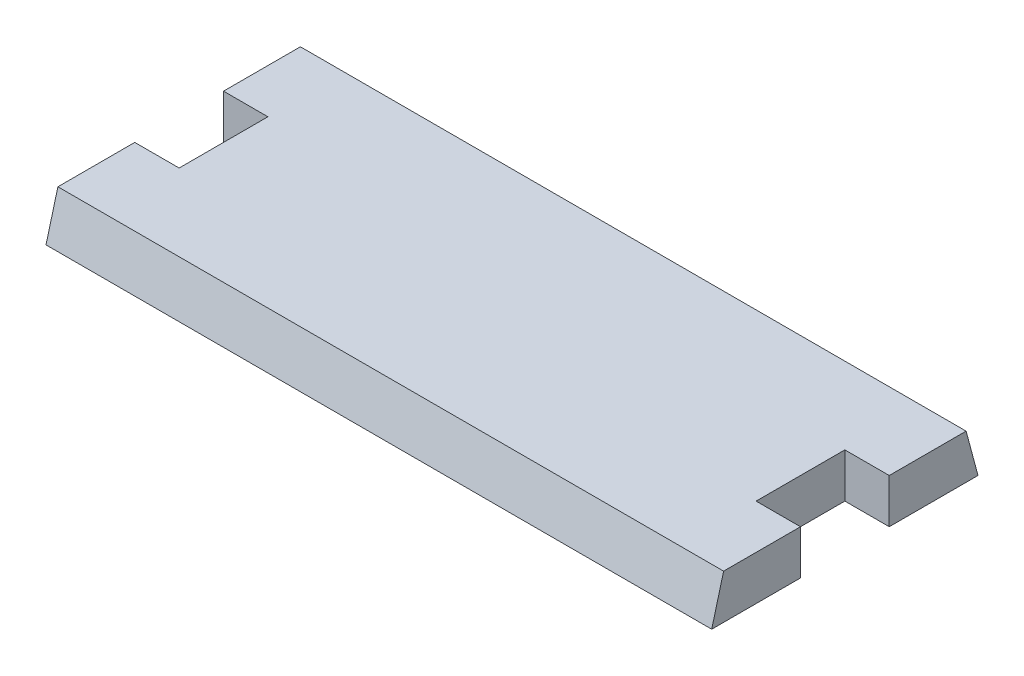
ISO-10303-21;
HEADER;
FILE_DESCRIPTION(('STEP AP214'),'2;1');
FILE_NAME('part.step','',(''),(''),'','','');
FILE_SCHEMA(('AUTOMOTIVE_DESIGN { 1 0 10303 214 1 1 1 1 }'));
ENDSEC;
DATA;
#1=APPLICATION_CONTEXT('core data for automotive mechanical design processes');
#2=APPLICATION_PROTOCOL_DEFINITION('international standard','automotive_design',2000,#1);
#3=PRODUCT_CONTEXT('',#1,'mechanical');
#4=PRODUCT('Part','Part','',(#3));
#5=PRODUCT_RELATED_PRODUCT_CATEGORY('part','',(#4));
#6=PRODUCT_DEFINITION_FORMATION('','',#4);
#7=PRODUCT_DEFINITION_CONTEXT('part definition',#1,'design');
#8=PRODUCT_DEFINITION('design','',#6,#7);
#9=PRODUCT_DEFINITION_SHAPE('','',#8);
#10=(LENGTH_UNIT() NAMED_UNIT(*) SI_UNIT(.MILLI.,.METRE.));
#11=(NAMED_UNIT(*) PLANE_ANGLE_UNIT() SI_UNIT($,.RADIAN.));
#12=(NAMED_UNIT(*) SI_UNIT($,.STERADIAN.) SOLID_ANGLE_UNIT());
#13=UNCERTAINTY_MEASURE_WITH_UNIT(LENGTH_MEASURE(1.E-05),#10,'distance_accuracy_value','');
#14=(GEOMETRIC_REPRESENTATION_CONTEXT(3) GLOBAL_UNCERTAINTY_ASSIGNED_CONTEXT((#13)) GLOBAL_UNIT_ASSIGNED_CONTEXT((#10,
#11,#12)) REPRESENTATION_CONTEXT('',''));
#15=CARTESIAN_POINT('',(0.,0.,0.));
#16=DIRECTION('',(0.,0.,1.));
#17=DIRECTION('',(1.,0.,0.));
#18=AXIS2_PLACEMENT_3D('',#15,#16,#17);
#19=CARTESIAN_POINT('',(75.,10.,10.));
#20=DIRECTION('',(-1.,0.,0.));
#21=DIRECTION('',(0.,0.,1.));
#22=AXIS2_PLACEMENT_3D('',#19,#20,#21);
#23=PLANE('',#22);
#24=DIRECTION('',(0.,0.,-1.));
#25=VECTOR('',#24,1.);
#26=CARTESIAN_POINT('',(75.,0.,10.));
#27=LINE('',#26,#25);
#28=CARTESIAN_POINT('',(75.,0.,30.));
#29=VERTEX_POINT('',#28);
#30=CARTESIAN_POINT('',(75.,0.,10.));
#31=VERTEX_POINT('',#30);
#32=EDGE_CURVE('E151',#29,#31,#27,.T.);
#33=ORIENTED_EDGE('',*,*,#32,.T.);
#34=DIRECTION('',(0.,-1.,0.));
#35=VECTOR('',#34,1.);
#36=CARTESIAN_POINT('',(75.,10.,10.));
#37=LINE('',#36,#35);
#38=CARTESIAN_POINT('',(75.,10.,10.));
#39=VERTEX_POINT('',#38);
#40=EDGE_CURVE('E11',#39,#31,#37,.T.);
#41=ORIENTED_EDGE('',*,*,#40,.F.);
#42=DIRECTION('',(0.,0.,-1.));
#43=VECTOR('',#42,1.);
#44=CARTESIAN_POINT('',(75.,10.,10.));
#45=LINE('',#44,#43);
#46=CARTESIAN_POINT('',(75.,10.,27.3205080756888));
#47=VERTEX_POINT('',#46);
#48=EDGE_CURVE('E141',#47,#39,#45,.T.);
#49=ORIENTED_EDGE('',*,*,#48,.F.);
#50=DIRECTION('',(0.,0.965925826289068,-0.258819045102521));
#51=VECTOR('',#50,1.);
#52=CARTESIAN_POINT('',(75.,14.3301270189222,26.1602540378444));
#53=LINE('',#52,#51);
#54=EDGE_CURVE('E46',#47,#29,#53,.F.);
#55=ORIENTED_EDGE('',*,*,#54,.T.);
#56=EDGE_LOOP('',(#33,#41,#49,#55));
#57=FACE_BOUND('',#56,.T.);
#58=ADVANCED_FACE('F42',(#57),#23,.F.);
#59=CARTESIAN_POINT('',(75.,10.,10.));
#60=DIRECTION('',(0.,0.,1.));
#61=DIRECTION('',(1.,0.,0.));
#62=AXIS2_PLACEMENT_3D('',#59,#60,#61);
#63=PLANE('',#62);
#64=DIRECTION('',(-1.,0.,0.));
#65=VECTOR('',#64,1.);
#66=CARTESIAN_POINT('',(75.,0.,10.));
#67=LINE('',#66,#65);
#68=CARTESIAN_POINT('',(65.,0.,10.));
#69=VERTEX_POINT('',#68);
#70=EDGE_CURVE('E155',#31,#69,#67,.T.);
#71=ORIENTED_EDGE('',*,*,#70,.T.);
#72=DIRECTION('',(0.,-1.,0.));
#73=VECTOR('',#72,1.);
#74=CARTESIAN_POINT('',(65.,10.,10.));
#75=LINE('',#74,#73);
#76=CARTESIAN_POINT('',(65.,10.,10.));
#77=VERTEX_POINT('',#76);
#78=EDGE_CURVE('E52',#77,#69,#75,.T.);
#79=ORIENTED_EDGE('',*,*,#78,.F.);
#80=DIRECTION('',(-1.,0.,0.));
#81=VECTOR('',#80,1.);
#82=CARTESIAN_POINT('',(75.,10.,10.));
#83=LINE('',#82,#81);
#84=EDGE_CURVE('E133',#39,#77,#83,.T.);
#85=ORIENTED_EDGE('',*,*,#84,.F.);
#86=ORIENTED_EDGE('',*,*,#40,.T.);
#87=EDGE_LOOP('',(#71,#79,#85,#86));
#88=FACE_BOUND('',#87,.T.);
#89=ADVANCED_FACE('F134',(#88),#63,.F.);
#90=CARTESIAN_POINT('',(65.,10.,-10.));
#91=DIRECTION('',(-1.,0.,0.));
#92=DIRECTION('',(0.,0.,1.));
#93=AXIS2_PLACEMENT_3D('',#90,#91,#92);
#94=PLANE('',#93);
#95=DIRECTION('',(0.,0.,-1.));
#96=VECTOR('',#95,1.);
#97=CARTESIAN_POINT('',(65.,0.,-10.));
#98=LINE('',#97,#96);
#99=CARTESIAN_POINT('',(65.,0.,-10.));
#100=VERTEX_POINT('',#99);
#101=EDGE_CURVE('E158',#69,#100,#98,.T.);
#102=ORIENTED_EDGE('',*,*,#101,.T.);
#103=DIRECTION('',(0.,-1.,0.));
#104=VECTOR('',#103,1.);
#105=CARTESIAN_POINT('',(65.,10.,-10.));
#106=LINE('',#105,#104);
#107=CARTESIAN_POINT('',(65.,10.,-10.));
#108=VERTEX_POINT('',#107);
#109=EDGE_CURVE('E213',#108,#100,#106,.T.);
#110=ORIENTED_EDGE('',*,*,#109,.F.);
#111=DIRECTION('',(0.,0.,-1.));
#112=VECTOR('',#111,1.);
#113=CARTESIAN_POINT('',(65.,10.,-10.));
#114=LINE('',#113,#112);
#115=EDGE_CURVE('E140',#77,#108,#114,.T.);
#116=ORIENTED_EDGE('',*,*,#115,.F.);
#117=ORIENTED_EDGE('',*,*,#78,.T.);
#118=EDGE_LOOP('',(#102,#110,#116,#117));
#119=FACE_BOUND('',#118,.T.);
#120=ADVANCED_FACE('F259',(#119),#94,.F.);
#121=CARTESIAN_POINT('',(75.,10.,-10.));
#122=DIRECTION('',(0.,0.,-1.));
#123=DIRECTION('',(-1.,0.,0.));
#124=AXIS2_PLACEMENT_3D('',#121,#122,#123);
#125=PLANE('',#124);
#126=DIRECTION('',(1.,0.,0.));
#127=VECTOR('',#126,1.);
#128=CARTESIAN_POINT('',(75.,0.,-10.));
#129=LINE('',#128,#127);
#130=CARTESIAN_POINT('',(75.,0.,-10.));
#131=VERTEX_POINT('',#130);
#132=EDGE_CURVE('E165',#100,#131,#129,.T.);
#133=ORIENTED_EDGE('',*,*,#132,.T.);
#134=DIRECTION('',(0.,-1.,0.));
#135=VECTOR('',#134,1.);
#136=CARTESIAN_POINT('',(75.,10.,-10.));
#137=LINE('',#136,#135);
#138=CARTESIAN_POINT('',(75.,10.,-10.));
#139=VERTEX_POINT('',#138);
#140=EDGE_CURVE('E209',#139,#131,#137,.T.);
#141=ORIENTED_EDGE('',*,*,#140,.F.);
#142=DIRECTION('',(1.,0.,0.));
#143=VECTOR('',#142,1.);
#144=CARTESIAN_POINT('',(75.,10.,-10.));
#145=LINE('',#144,#143);
#146=EDGE_CURVE('E251',#108,#139,#145,.T.);
#147=ORIENTED_EDGE('',*,*,#146,.F.);
#148=ORIENTED_EDGE('',*,*,#109,.T.);
#149=EDGE_LOOP('',(#133,#141,#147,#148));
#150=FACE_BOUND('',#149,.T.);
#151=ADVANCED_FACE('F263',(#150),#125,.F.);
#152=CARTESIAN_POINT('',(75.,10.,-30.));
#153=DIRECTION('',(-1.,0.,0.));
#154=DIRECTION('',(0.,0.,1.));
#155=AXIS2_PLACEMENT_3D('',#152,#153,#154);
#156=PLANE('',#155);
#157=DIRECTION('',(0.,0.,-1.));
#158=VECTOR('',#157,1.);
#159=CARTESIAN_POINT('',(75.,0.,-30.));
#160=LINE('',#159,#158);
#161=CARTESIAN_POINT('',(75.,0.,-30.));
#162=VERTEX_POINT('',#161);
#163=EDGE_CURVE('E168',#131,#162,#160,.T.);
#164=ORIENTED_EDGE('',*,*,#163,.T.);
#165=DIRECTION('',(0.,0.965925826289068,0.258819045102521));
#166=VECTOR('',#165,1.);
#167=CARTESIAN_POINT('',(75.,0.,-30.));
#168=LINE('',#167,#166);
#169=CARTESIAN_POINT('',(75.,10.,-27.3205080756887));
#170=VERTEX_POINT('',#169);
#171=EDGE_CURVE('E214',#170,#162,#168,.F.);
#172=ORIENTED_EDGE('',*,*,#171,.F.);
#173=DIRECTION('',(0.,0.,-1.));
#174=VECTOR('',#173,1.);
#175=CARTESIAN_POINT('',(75.,10.,-30.));
#176=LINE('',#175,#174);
#177=EDGE_CURVE('E227',#139,#170,#176,.T.);
#178=ORIENTED_EDGE('',*,*,#177,.F.);
#179=ORIENTED_EDGE('',*,*,#140,.T.);
#180=EDGE_LOOP('',(#164,#172,#178,#179));
#181=FACE_BOUND('',#180,.T.);
#182=ADVANCED_FACE('F268',(#181),#156,.F.);
#183=CARTESIAN_POINT('',(-75.,0.,-30.));
#184=DIRECTION('',(0.,0.258819045102521,-0.965925826289068));
#185=DIRECTION('',(0.,0.965925826289068,0.258819045102521));
#186=AXIS2_PLACEMENT_3D('',#183,#184,#185);
#187=PLANE('',#186);
#188=DIRECTION('',(-1.,0.,0.));
#189=VECTOR('',#188,1.);
#190=CARTESIAN_POINT('',(-75.,0.,-30.));
#191=LINE('',#190,#189);
#192=CARTESIAN_POINT('',(-75.,0.,-30.));
#193=VERTEX_POINT('',#192);
#194=EDGE_CURVE('E171',#162,#193,#191,.T.);
#195=ORIENTED_EDGE('',*,*,#194,.T.);
#196=DIRECTION('',(0.,0.965925826289068,0.258819045102521));
#197=VECTOR('',#196,1.);
#198=CARTESIAN_POINT('',(-75.,9.33012701892219,-27.5));
#199=LINE('',#198,#197);
#200=CARTESIAN_POINT('',(-75.,10.,-27.3205080756887));
#201=VERTEX_POINT('',#200);
#202=EDGE_CURVE('E208',#201,#193,#199,.F.);
#203=ORIENTED_EDGE('',*,*,#202,.F.);
#204=DIRECTION('',(1.,0.,0.));
#205=VECTOR('',#204,1.);
#206=CARTESIAN_POINT('',(-75.,10.,-27.3205080756887));
#207=LINE('',#206,#205);
#208=EDGE_CURVE('E223',#170,#201,#207,.F.);
#209=ORIENTED_EDGE('',*,*,#208,.F.);
#210=ORIENTED_EDGE('',*,*,#171,.T.);
#211=EDGE_LOOP('',(#195,#203,#209,#210));
#212=FACE_BOUND('',#211,.T.);
#213=ADVANCED_FACE('F274',(#212),#187,.T.);
#214=CARTESIAN_POINT('',(-75.,10.,-30.));
#215=DIRECTION('',(1.,0.,0.));
#216=DIRECTION('',(0.,0.,-1.));
#217=AXIS2_PLACEMENT_3D('',#214,#215,#216);
#218=PLANE('',#217);
#219=DIRECTION('',(0.,0.,1.));
#220=VECTOR('',#219,1.);
#221=CARTESIAN_POINT('',(-75.,0.,-30.));
#222=LINE('',#221,#220);
#223=CARTESIAN_POINT('',(-75.,0.,-10.));
#224=VERTEX_POINT('',#223);
#225=EDGE_CURVE('E174',#193,#224,#222,.T.);
#226=ORIENTED_EDGE('',*,*,#225,.T.);
#227=DIRECTION('',(0.,-1.,0.));
#228=VECTOR('',#227,1.);
#229=CARTESIAN_POINT('',(-75.,10.,-10.));
#230=LINE('',#229,#228);
#231=CARTESIAN_POINT('',(-75.,10.,-10.));
#232=VERTEX_POINT('',#231);
#233=EDGE_CURVE('E204',#232,#224,#230,.T.);
#234=ORIENTED_EDGE('',*,*,#233,.F.);
#235=DIRECTION('',(0.,0.,1.));
#236=VECTOR('',#235,1.);
#237=CARTESIAN_POINT('',(-75.,10.,-30.));
#238=LINE('',#237,#236);
#239=EDGE_CURVE('E226',#201,#232,#238,.T.);
#240=ORIENTED_EDGE('',*,*,#239,.F.);
#241=ORIENTED_EDGE('',*,*,#202,.T.);
#242=EDGE_LOOP('',(#226,#234,#240,#241));
#243=FACE_BOUND('',#242,.T.);
#244=ADVANCED_FACE('F278',(#243),#218,.F.);
#245=CARTESIAN_POINT('',(-75.,10.,-10.));
#246=DIRECTION('',(0.,0.,-1.));
#247=DIRECTION('',(-1.,0.,0.));
#248=AXIS2_PLACEMENT_3D('',#245,#246,#247);
#249=PLANE('',#248);
#250=DIRECTION('',(1.,0.,0.));
#251=VECTOR('',#250,1.);
#252=CARTESIAN_POINT('',(-75.,0.,-10.));
#253=LINE('',#252,#251);
#254=CARTESIAN_POINT('',(-65.,0.,-10.));
#255=VERTEX_POINT('',#254);
#256=EDGE_CURVE('E177',#224,#255,#253,.T.);
#257=ORIENTED_EDGE('',*,*,#256,.T.);
#258=DIRECTION('',(0.,-1.,0.));
#259=VECTOR('',#258,1.);
#260=CARTESIAN_POINT('',(-65.,10.,-10.));
#261=LINE('',#260,#259);
#262=CARTESIAN_POINT('',(-65.,10.,-10.));
#263=VERTEX_POINT('',#262);
#264=EDGE_CURVE('E200',#263,#255,#261,.T.);
#265=ORIENTED_EDGE('',*,*,#264,.F.);
#266=DIRECTION('',(1.,0.,0.));
#267=VECTOR('',#266,1.);
#268=CARTESIAN_POINT('',(-75.,10.,-10.));
#269=LINE('',#268,#267);
#270=EDGE_CURVE('E242',#232,#263,#269,.T.);
#271=ORIENTED_EDGE('',*,*,#270,.F.);
#272=ORIENTED_EDGE('',*,*,#233,.T.);
#273=EDGE_LOOP('',(#257,#265,#271,#272));
#274=FACE_BOUND('',#273,.T.);
#275=ADVANCED_FACE('F283',(#274),#249,.F.);
#276=CARTESIAN_POINT('',(-65.,10.,-10.));
#277=DIRECTION('',(1.,0.,0.));
#278=DIRECTION('',(0.,0.,-1.));
#279=AXIS2_PLACEMENT_3D('',#276,#277,#278);
#280=PLANE('',#279);
#281=DIRECTION('',(0.,0.,1.));
#282=VECTOR('',#281,1.);
#283=CARTESIAN_POINT('',(-65.,0.,-10.));
#284=LINE('',#283,#282);
#285=CARTESIAN_POINT('',(-65.,0.,10.));
#286=VERTEX_POINT('',#285);
#287=EDGE_CURVE('E180',#255,#286,#284,.T.);
#288=ORIENTED_EDGE('',*,*,#287,.T.);
#289=DIRECTION('',(0.,-1.,0.));
#290=VECTOR('',#289,1.);
#291=CARTESIAN_POINT('',(-65.,10.,10.));
#292=LINE('',#291,#290);
#293=CARTESIAN_POINT('',(-65.,10.,10.));
#294=VERTEX_POINT('',#293);
#295=EDGE_CURVE('E195',#294,#286,#292,.T.);
#296=ORIENTED_EDGE('',*,*,#295,.F.);
#297=DIRECTION('',(0.,0.,1.));
#298=VECTOR('',#297,1.);
#299=CARTESIAN_POINT('',(-65.,10.,-10.));
#300=LINE('',#299,#298);
#301=EDGE_CURVE('E238',#263,#294,#300,.T.);
#302=ORIENTED_EDGE('',*,*,#301,.F.);
#303=ORIENTED_EDGE('',*,*,#264,.T.);
#304=EDGE_LOOP('',(#288,#296,#302,#303));
#305=FACE_BOUND('',#304,.T.);
#306=ADVANCED_FACE('F287',(#305),#280,.F.);
#307=CARTESIAN_POINT('',(-75.,10.,10.));
#308=DIRECTION('',(0.,0.,1.));
#309=DIRECTION('',(1.,0.,0.));
#310=AXIS2_PLACEMENT_3D('',#307,#308,#309);
#311=PLANE('',#310);
#312=DIRECTION('',(-1.,0.,0.));
#313=VECTOR('',#312,1.);
#314=CARTESIAN_POINT('',(-75.,0.,10.));
#315=LINE('',#314,#313);
#316=CARTESIAN_POINT('',(-75.,0.,10.));
#317=VERTEX_POINT('',#316);
#318=EDGE_CURVE('E183',#286,#317,#315,.T.);
#319=ORIENTED_EDGE('',*,*,#318,.T.);
#320=DIRECTION('',(0.,-1.,0.));
#321=VECTOR('',#320,1.);
#322=CARTESIAN_POINT('',(-75.,10.,10.));
#323=LINE('',#322,#321);
#324=CARTESIAN_POINT('',(-75.,10.,10.));
#325=VERTEX_POINT('',#324);
#326=EDGE_CURVE('E191',#325,#317,#323,.T.);
#327=ORIENTED_EDGE('',*,*,#326,.F.);
#328=DIRECTION('',(-1.,0.,0.));
#329=VECTOR('',#328,1.);
#330=CARTESIAN_POINT('',(-75.,10.,10.));
#331=LINE('',#330,#329);
#332=EDGE_CURVE('E236',#294,#325,#331,.T.);
#333=ORIENTED_EDGE('',*,*,#332,.F.);
#334=ORIENTED_EDGE('',*,*,#295,.T.);
#335=EDGE_LOOP('',(#319,#327,#333,#334));
#336=FACE_BOUND('',#335,.T.);
#337=ADVANCED_FACE('F291',(#336),#311,.F.);
#338=CARTESIAN_POINT('',(-75.,10.,10.));
#339=DIRECTION('',(1.,0.,0.));
#340=DIRECTION('',(0.,0.,-1.));
#341=AXIS2_PLACEMENT_3D('',#338,#339,#340);
#342=PLANE('',#341);
#343=DIRECTION('',(0.,0.,1.));
#344=VECTOR('',#343,1.);
#345=CARTESIAN_POINT('',(-75.,0.,10.));
#346=LINE('',#345,#344);
#347=CARTESIAN_POINT('',(-75.,0.,30.));
#348=VERTEX_POINT('',#347);
#349=EDGE_CURVE('E186',#317,#348,#346,.T.);
#350=ORIENTED_EDGE('',*,*,#349,.T.);
#351=DIRECTION('',(0.,0.965925826289068,-0.258819045102521));
#352=VECTOR('',#351,1.);
#353=CARTESIAN_POINT('',(-75.,0.,30.));
#354=LINE('',#353,#352);
#355=CARTESIAN_POINT('',(-75.,10.,27.3205080756888));
#356=VERTEX_POINT('',#355);
#357=EDGE_CURVE('E196',#356,#348,#354,.F.);
#358=ORIENTED_EDGE('',*,*,#357,.F.);
#359=DIRECTION('',(0.,0.,1.));
#360=VECTOR('',#359,1.);
#361=CARTESIAN_POINT('',(-75.,10.,10.));
#362=LINE('',#361,#360);
#363=EDGE_CURVE('E65',#325,#356,#362,.T.);
#364=ORIENTED_EDGE('',*,*,#363,.F.);
#365=ORIENTED_EDGE('',*,*,#326,.T.);
#366=EDGE_LOOP('',(#350,#358,#364,#365));
#367=FACE_BOUND('',#366,.T.);
#368=ADVANCED_FACE('F294',(#367),#342,.F.);
#369=CARTESIAN_POINT('',(-75.,0.,30.));
#370=DIRECTION('',(0.,0.258819045102521,0.965925826289068));
#371=DIRECTION('',(0.,-0.965925826289068,0.258819045102521));
#372=AXIS2_PLACEMENT_3D('',#369,#370,#371);
#373=PLANE('',#372);
#374=DIRECTION('',(1.,0.,0.));
#375=VECTOR('',#374,1.);
#376=CARTESIAN_POINT('',(-75.,0.,30.));
#377=LINE('',#376,#375);
#378=EDGE_CURVE('E148',#348,#29,#377,.T.);
#379=ORIENTED_EDGE('',*,*,#378,.T.);
#380=ORIENTED_EDGE('',*,*,#54,.F.);
#381=DIRECTION('',(-1.,0.,0.));
#382=VECTOR('',#381,1.);
#383=CARTESIAN_POINT('',(-75.,10.,27.3205080756888));
#384=LINE('',#383,#382);
#385=EDGE_CURVE('E60',#356,#47,#384,.F.);
#386=ORIENTED_EDGE('',*,*,#385,.F.);
#387=ORIENTED_EDGE('',*,*,#357,.T.);
#388=EDGE_LOOP('',(#379,#380,#386,#387));
#389=FACE_BOUND('',#388,.T.);
#390=ADVANCED_FACE('F44',(#389),#373,.T.);
#391=CARTESIAN_POINT('',(0.,10.,0.));
#392=DIRECTION('',(0.,1.,0.));
#393=DIRECTION('',(0.,0.,1.));
#394=AXIS2_PLACEMENT_3D('',#391,#392,#393);
#395=PLANE('',#394);
#396=ORIENTED_EDGE('',*,*,#48,.T.);
#397=ORIENTED_EDGE('',*,*,#84,.T.);
#398=ORIENTED_EDGE('',*,*,#115,.T.);
#399=ORIENTED_EDGE('',*,*,#146,.T.);
#400=ORIENTED_EDGE('',*,*,#177,.T.);
#401=ORIENTED_EDGE('',*,*,#208,.T.);
#402=ORIENTED_EDGE('',*,*,#239,.T.);
#403=ORIENTED_EDGE('',*,*,#270,.T.);
#404=ORIENTED_EDGE('',*,*,#301,.T.);
#405=ORIENTED_EDGE('',*,*,#332,.T.);
#406=ORIENTED_EDGE('',*,*,#363,.T.);
#407=ORIENTED_EDGE('',*,*,#385,.T.);
#408=EDGE_LOOP('',(#396,#397,#398,#399,#400,#401,#402,#403,#404,#405,#406,#407));
#409=FACE_BOUND('',#408,.T.);
#410=ADVANCED_FACE('F144',(#409),#395,.T.);
#411=CARTESIAN_POINT('',(0.,0.,0.));
#412=DIRECTION('',(0.,1.,0.));
#413=DIRECTION('',(0.,0.,1.));
#414=AXIS2_PLACEMENT_3D('',#411,#412,#413);
#415=PLANE('',#414);
#416=ORIENTED_EDGE('',*,*,#32,.F.);
#417=ORIENTED_EDGE('',*,*,#378,.F.);
#418=ORIENTED_EDGE('',*,*,#349,.F.);
#419=ORIENTED_EDGE('',*,*,#318,.F.);
#420=ORIENTED_EDGE('',*,*,#287,.F.);
#421=ORIENTED_EDGE('',*,*,#256,.F.);
#422=ORIENTED_EDGE('',*,*,#225,.F.);
#423=ORIENTED_EDGE('',*,*,#194,.F.);
#424=ORIENTED_EDGE('',*,*,#163,.F.);
#425=ORIENTED_EDGE('',*,*,#132,.F.);
#426=ORIENTED_EDGE('',*,*,#101,.F.);
#427=ORIENTED_EDGE('',*,*,#70,.F.);
#428=EDGE_LOOP('',(#416,#417,#418,#419,#420,#421,#422,#423,#424,#425,#426,#427));
#429=FACE_BOUND('',#428,.T.);
#430=ADVANCED_FACE('F296',(#429),#415,.F.);
#431=CLOSED_SHELL('',(#58,#89,#120,#151,#182,#213,#244,#275,#306,#337,#368,#390,#410,#430));
#432=MANIFOLD_SOLID_BREP('B2',#431);
#433=ADVANCED_BREP_SHAPE_REPRESENTATION('',(#18,#432),#14);
#434=SHAPE_DEFINITION_REPRESENTATION(#9,#433);
ENDSEC;
END-ISO-10303-21;
